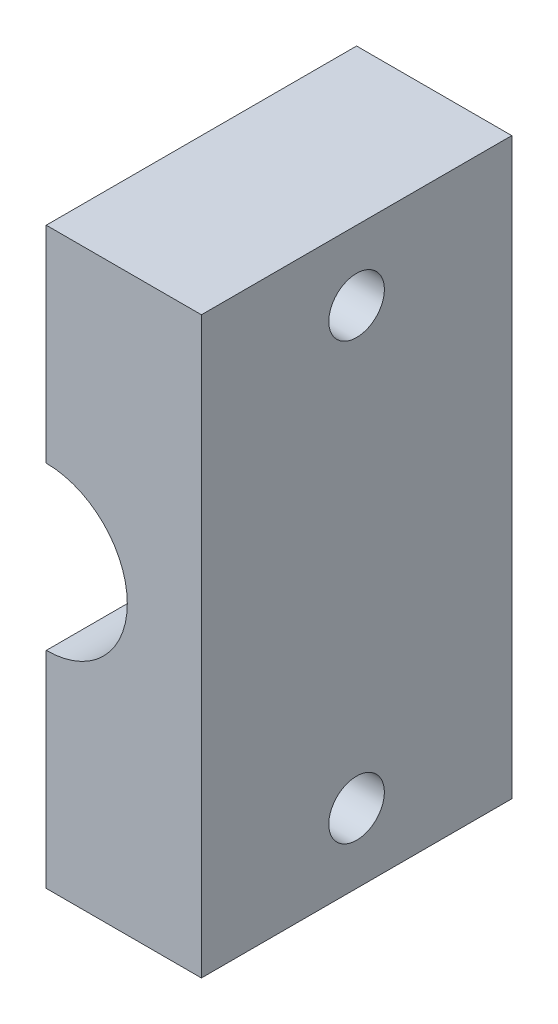
ISO-10303-21;
HEADER;
FILE_DESCRIPTION(('STEP AP214'),'2;1');
FILE_NAME('part.step','',(''),(''),'','','');
FILE_SCHEMA(('AUTOMOTIVE_DESIGN { 1 0 10303 214 1 1 1 1 }'));
ENDSEC;
DATA;
#1=APPLICATION_CONTEXT('core data for automotive mechanical design processes');
#2=APPLICATION_PROTOCOL_DEFINITION('international standard','automotive_design',2000,#1);
#3=PRODUCT_CONTEXT('',#1,'mechanical');
#4=PRODUCT('Part','Part','',(#3));
#5=PRODUCT_RELATED_PRODUCT_CATEGORY('part','',(#4));
#6=PRODUCT_DEFINITION_FORMATION('','',#4);
#7=PRODUCT_DEFINITION_CONTEXT('part definition',#1,'design');
#8=PRODUCT_DEFINITION('design','',#6,#7);
#9=PRODUCT_DEFINITION_SHAPE('','',#8);
#10=(LENGTH_UNIT() NAMED_UNIT(*) SI_UNIT(.MILLI.,.METRE.));
#11=(NAMED_UNIT(*) PLANE_ANGLE_UNIT() SI_UNIT($,.RADIAN.));
#12=(NAMED_UNIT(*) SI_UNIT($,.STERADIAN.) SOLID_ANGLE_UNIT());
#13=UNCERTAINTY_MEASURE_WITH_UNIT(LENGTH_MEASURE(1.E-05),#10,'distance_accuracy_value','');
#14=(GEOMETRIC_REPRESENTATION_CONTEXT(3) GLOBAL_UNCERTAINTY_ASSIGNED_CONTEXT((#13)) GLOBAL_UNIT_ASSIGNED_CONTEXT((#10,
#11,#12)) REPRESENTATION_CONTEXT('',''));
#15=CARTESIAN_POINT('',(0.,0.,0.));
#16=DIRECTION('',(0.,0.,1.));
#17=DIRECTION('',(1.,0.,0.));
#18=AXIS2_PLACEMENT_3D('',#15,#16,#17);
#19=CARTESIAN_POINT('',(0.,0.,2.7));
#20=DIRECTION('',(1.,0.,0.));
#21=DIRECTION('',(0.,0.,-1.));
#22=AXIS2_PLACEMENT_3D('',#19,#20,#21);
#23=PLANE('',#22);
#24=CARTESIAN_POINT('',(0.,4.7,1.35));
#25=DIRECTION('',(1.,0.,0.));
#26=DIRECTION('',(0.,0.,-1.));
#27=AXIS2_PLACEMENT_3D('',#24,#25,#26);
#28=CIRCLE('',#27,0.6);
#29=CARTESIAN_POINT('',(0.,4.7,0.75));
#30=VERTEX_POINT('',#29);
#31=EDGE_CURVE('E190',#30,#30,#28,.T.);
#32=ORIENTED_EDGE('',*,*,#31,.T.);
#33=EDGE_LOOP('',(#32));
#34=FACE_BOUND('',#33,.T.);
#35=DIRECTION('',(0.,-1.,0.));
#36=VECTOR('',#35,1.);
#37=CARTESIAN_POINT('',(0.,6.2,-2.));
#38=LINE('',#37,#36);
#39=CARTESIAN_POINT('',(0.,6.2,-2.));
#40=VERTEX_POINT('',#39);
#41=CARTESIAN_POINT('',(0.,1.75,-2.));
#42=VERTEX_POINT('',#41);
#43=EDGE_CURVE('E141',#40,#42,#38,.T.);
#44=ORIENTED_EDGE('',*,*,#43,.T.);
#45=DIRECTION('',(0.,0.,1.));
#46=VECTOR('',#45,1.);
#47=CARTESIAN_POINT('',(0.,1.75,-2.));
#48=LINE('',#47,#46);
#49=CARTESIAN_POINT('',(0.,1.75,0.));
#50=VERTEX_POINT('',#49);
#51=EDGE_CURVE('E56',#42,#50,#48,.T.);
#52=ORIENTED_EDGE('',*,*,#51,.T.);
#53=DIRECTION('',(0.,-1.,0.));
#54=VECTOR('',#53,1.);
#55=CARTESIAN_POINT('',(0.,6.2,0.));
#56=LINE('',#55,#54);
#57=CARTESIAN_POINT('',(0.,3.2,0.));
#58=VERTEX_POINT('',#57);
#59=EDGE_CURVE('E142',#58,#50,#56,.T.);
#60=ORIENTED_EDGE('',*,*,#59,.F.);
#61=DIRECTION('',(0.,0.,-1.));
#62=VECTOR('',#61,1.);
#63=CARTESIAN_POINT('',(0.,3.2,2.7));
#64=LINE('',#63,#62);
#65=CARTESIAN_POINT('',(0.,3.2,2.7));
#66=VERTEX_POINT('',#65);
#67=EDGE_CURVE('E160',#66,#58,#64,.T.);
#68=ORIENTED_EDGE('',*,*,#67,.F.);
#69=DIRECTION('',(0.,1.,0.));
#70=VECTOR('',#69,1.);
#71=CARTESIAN_POINT('',(0.,0.,2.7));
#72=LINE('',#71,#70);
#73=CARTESIAN_POINT('',(0.,1.75,2.7));
#74=VERTEX_POINT('',#73);
#75=EDGE_CURVE('E182',#74,#66,#72,.T.);
#76=ORIENTED_EDGE('',*,*,#75,.F.);
#77=CARTESIAN_POINT('',(0.,1.75,4.7));
#78=VERTEX_POINT('',#77);
#79=EDGE_CURVE('E184',#74,#78,#48,.T.);
#80=ORIENTED_EDGE('',*,*,#79,.T.);
#81=DIRECTION('',(0.,1.,0.));
#82=VECTOR('',#81,1.);
#83=CARTESIAN_POINT('',(0.,0.,4.7));
#84=LINE('',#83,#82);
#85=CARTESIAN_POINT('',(0.,6.2,4.7));
#86=VERTEX_POINT('',#85);
#87=EDGE_CURVE('E231',#78,#86,#84,.T.);
#88=ORIENTED_EDGE('',*,*,#87,.T.);
#89=DIRECTION('',(0.,0.,-1.));
#90=VECTOR('',#89,1.);
#91=CARTESIAN_POINT('',(0.,6.2,2.7));
#92=LINE('',#91,#90);
#93=EDGE_CURVE('E164',#86,#40,#92,.T.);
#94=ORIENTED_EDGE('',*,*,#93,.T.);
#95=EDGE_LOOP('',(#44,#52,#60,#68,#76,#80,#88,#94));
#96=FACE_BOUND('',#95,.T.);
#97=ADVANCED_FACE('F41',(#34,#96),#23,.F.);
#98=CARTESIAN_POINT('',(0.,0.,2.7));
#99=DIRECTION('',(0.,0.,-1.));
#100=DIRECTION('',(-1.,0.,0.));
#101=AXIS2_PLACEMENT_3D('',#98,#99,#100);
#102=CYLINDRICAL_SURFACE('',#101,3.2);
#103=CARTESIAN_POINT('',(0.,0.,0.));
#104=DIRECTION('',(0.,0.,1.));
#105=DIRECTION('',(1.,0.,0.));
#106=AXIS2_PLACEMENT_3D('',#103,#104,#105);
#107=CIRCLE('',#106,3.2);
#108=CARTESIAN_POINT('',(0.,-3.2,0.));
#109=VERTEX_POINT('',#108);
#110=EDGE_CURVE('E155',#109,#58,#107,.T.);
#111=ORIENTED_EDGE('',*,*,#110,.F.);
#112=DIRECTION('',(0.,0.,-1.));
#113=VECTOR('',#112,1.);
#114=CARTESIAN_POINT('',(0.,-3.2,2.7));
#115=LINE('',#114,#113);
#116=CARTESIAN_POINT('',(0.,-3.2,2.7));
#117=VERTEX_POINT('',#116);
#118=EDGE_CURVE('E49',#117,#109,#115,.T.);
#119=ORIENTED_EDGE('',*,*,#118,.F.);
#120=CARTESIAN_POINT('',(0.,0.,2.7));
#121=DIRECTION('',(0.,0.,1.));
#122=DIRECTION('',(1.,0.,0.));
#123=AXIS2_PLACEMENT_3D('',#120,#121,#122);
#124=CIRCLE('',#123,3.2);
#125=EDGE_CURVE('E157',#117,#66,#124,.T.);
#126=ORIENTED_EDGE('',*,*,#125,.T.);
#127=ORIENTED_EDGE('',*,*,#67,.T.);
#128=EDGE_LOOP('',(#111,#119,#126,#127));
#129=FACE_BOUND('',#128,.T.);
#130=ADVANCED_FACE('F43',(#129),#102,.F.);
#131=CARTESIAN_POINT('',(0.,-6.2,2.7));
#132=DIRECTION('',(0.,1.,0.));
#133=DIRECTION('',(0.,0.,1.));
#134=AXIS2_PLACEMENT_3D('',#131,#132,#133);
#135=PLANE('',#134);
#136=DIRECTION('',(0.,0.,-1.));
#137=VECTOR('',#136,1.);
#138=CARTESIAN_POINT('',(0.,-6.2,2.7));
#139=LINE('',#138,#137);
#140=CARTESIAN_POINT('',(0.,-6.2,4.7));
#141=VERTEX_POINT('',#140);
#142=CARTESIAN_POINT('',(0.,-6.2,-2.));
#143=VERTEX_POINT('',#142);
#144=EDGE_CURVE('E170',#141,#143,#139,.T.);
#145=ORIENTED_EDGE('',*,*,#144,.T.);
#146=DIRECTION('',(1.,0.,0.));
#147=VECTOR('',#146,1.);
#148=CARTESIAN_POINT('',(0.,-6.2,-2.));
#149=LINE('',#148,#147);
#150=CARTESIAN_POINT('',(3.35,-6.2,-2.));
#151=VERTEX_POINT('',#150);
#152=EDGE_CURVE('E140',#143,#151,#149,.T.);
#153=ORIENTED_EDGE('',*,*,#152,.T.);
#154=DIRECTION('',(0.,0.,-1.));
#155=VECTOR('',#154,1.);
#156=CARTESIAN_POINT('',(3.35,-6.2,2.7));
#157=LINE('',#156,#155);
#158=CARTESIAN_POINT('',(3.35,-6.2,4.7));
#159=VERTEX_POINT('',#158);
#160=EDGE_CURVE('E168',#159,#151,#157,.T.);
#161=ORIENTED_EDGE('',*,*,#160,.F.);
#162=DIRECTION('',(-1.,0.,0.));
#163=VECTOR('',#162,1.);
#164=CARTESIAN_POINT('',(0.,-6.2,4.7));
#165=LINE('',#164,#163);
#166=EDGE_CURVE('E226',#159,#141,#165,.T.);
#167=ORIENTED_EDGE('',*,*,#166,.T.);
#168=EDGE_LOOP('',(#145,#153,#161,#167));
#169=FACE_BOUND('',#168,.T.);
#170=ADVANCED_FACE('F214',(#169),#135,.F.);
#171=CARTESIAN_POINT('',(3.35,0.,2.7));
#172=DIRECTION('',(1.,0.,0.));
#173=DIRECTION('',(0.,0.,-1.));
#174=AXIS2_PLACEMENT_3D('',#171,#172,#173);
#175=PLANE('',#174);
#176=CARTESIAN_POINT('',(3.35,-4.7,1.35));
#177=DIRECTION('',(1.,0.,0.));
#178=DIRECTION('',(0.,0.,-1.));
#179=AXIS2_PLACEMENT_3D('',#176,#177,#178);
#180=CIRCLE('',#179,0.6);
#181=CARTESIAN_POINT('',(3.35,-4.7,0.749999999999999));
#182=VERTEX_POINT('',#181);
#183=EDGE_CURVE('E196',#182,#182,#180,.T.);
#184=ORIENTED_EDGE('',*,*,#183,.F.);
#185=EDGE_LOOP('',(#184));
#186=FACE_BOUND('',#185,.T.);
#187=CARTESIAN_POINT('',(3.35,4.7,1.35));
#188=DIRECTION('',(1.,0.,0.));
#189=DIRECTION('',(0.,0.,-1.));
#190=AXIS2_PLACEMENT_3D('',#187,#188,#189);
#191=CIRCLE('',#190,0.6);
#192=CARTESIAN_POINT('',(3.35,4.7,0.75));
#193=VERTEX_POINT('',#192);
#194=EDGE_CURVE('E193',#193,#193,#191,.T.);
#195=ORIENTED_EDGE('',*,*,#194,.F.);
#196=EDGE_LOOP('',(#195));
#197=FACE_BOUND('',#196,.T.);
#198=ORIENTED_EDGE('',*,*,#160,.T.);
#199=DIRECTION('',(0.,-1.,0.));
#200=VECTOR('',#199,1.);
#201=CARTESIAN_POINT('',(3.35,6.2,-2.));
#202=LINE('',#201,#200);
#203=CARTESIAN_POINT('',(3.35,6.2,-2.));
#204=VERTEX_POINT('',#203);
#205=EDGE_CURVE('E151',#204,#151,#202,.T.);
#206=ORIENTED_EDGE('',*,*,#205,.F.);
#207=DIRECTION('',(0.,0.,-1.));
#208=VECTOR('',#207,1.);
#209=CARTESIAN_POINT('',(3.35,6.2,2.7));
#210=LINE('',#209,#208);
#211=CARTESIAN_POINT('',(3.35,6.2,4.7));
#212=VERTEX_POINT('',#211);
#213=EDGE_CURVE('E166',#212,#204,#210,.T.);
#214=ORIENTED_EDGE('',*,*,#213,.F.);
#215=DIRECTION('',(0.,1.,0.));
#216=VECTOR('',#215,1.);
#217=CARTESIAN_POINT('',(3.35,0.,4.7));
#218=LINE('',#217,#216);
#219=EDGE_CURVE('E221',#159,#212,#218,.T.);
#220=ORIENTED_EDGE('',*,*,#219,.F.);
#221=EDGE_LOOP('',(#198,#206,#214,#220));
#222=FACE_BOUND('',#221,.T.);
#223=ADVANCED_FACE('F210',(#186,#197,#222),#175,.T.);
#224=CARTESIAN_POINT('',(0.,6.2,2.7));
#225=DIRECTION('',(0.,1.,0.));
#226=DIRECTION('',(-1.,0.,0.));
#227=AXIS2_PLACEMENT_3D('',#224,#225,#226);
#228=PLANE('',#227);
#229=ORIENTED_EDGE('',*,*,#213,.T.);
#230=DIRECTION('',(1.,0.,0.));
#231=VECTOR('',#230,1.);
#232=CARTESIAN_POINT('',(0.,6.2,-2.));
#233=LINE('',#232,#231);
#234=EDGE_CURVE('E153',#40,#204,#233,.T.);
#235=ORIENTED_EDGE('',*,*,#234,.F.);
#236=ORIENTED_EDGE('',*,*,#93,.F.);
#237=DIRECTION('',(-1.,0.,0.));
#238=VECTOR('',#237,1.);
#239=CARTESIAN_POINT('',(0.,6.2,4.7));
#240=LINE('',#239,#238);
#241=EDGE_CURVE('E234',#212,#86,#240,.T.);
#242=ORIENTED_EDGE('',*,*,#241,.F.);
#243=EDGE_LOOP('',(#229,#235,#236,#242));
#244=FACE_BOUND('',#243,.T.);
#245=ADVANCED_FACE('F213',(#244),#228,.T.);
#246=CARTESIAN_POINT('',(0.,-4.7,1.35));
#247=DIRECTION('',(1.,0.,0.));
#248=DIRECTION('',(0.,0.,-1.));
#249=AXIS2_PLACEMENT_3D('',#246,#247,#248);
#250=CIRCLE('',#249,0.6);
#251=CARTESIAN_POINT('',(0.,-4.7,0.749999999999999));
#252=VERTEX_POINT('',#251);
#253=EDGE_CURVE('E124',#252,#252,#250,.T.);
#254=ORIENTED_EDGE('',*,*,#253,.T.);
#255=EDGE_LOOP('',(#254));
#256=FACE_BOUND('',#255,.T.);
#257=CARTESIAN_POINT('',(0.,-1.75,4.7));
#258=VERTEX_POINT('',#257);
#259=EDGE_CURVE('E228',#141,#258,#84,.T.);
#260=ORIENTED_EDGE('',*,*,#259,.T.);
#261=DIRECTION('',(0.,0.,1.));
#262=VECTOR('',#261,1.);
#263=CARTESIAN_POINT('',(0.,-1.75,-2.));
#264=LINE('',#263,#262);
#265=CARTESIAN_POINT('',(0.,-1.75,2.7));
#266=VERTEX_POINT('',#265);
#267=EDGE_CURVE('E64',#258,#266,#264,.F.);
#268=ORIENTED_EDGE('',*,*,#267,.T.);
#269=EDGE_CURVE('E148',#117,#266,#72,.T.);
#270=ORIENTED_EDGE('',*,*,#269,.F.);
#271=ORIENTED_EDGE('',*,*,#118,.T.);
#272=CARTESIAN_POINT('',(0.,-1.75,0.));
#273=VERTEX_POINT('',#272);
#274=EDGE_CURVE('E133',#273,#109,#56,.T.);
#275=ORIENTED_EDGE('',*,*,#274,.F.);
#276=CARTESIAN_POINT('',(0.,-1.75,-2.));
#277=VERTEX_POINT('',#276);
#278=EDGE_CURVE('E117',#273,#277,#264,.F.);
#279=ORIENTED_EDGE('',*,*,#278,.T.);
#280=EDGE_CURVE('E130',#277,#143,#38,.T.);
#281=ORIENTED_EDGE('',*,*,#280,.T.);
#282=ORIENTED_EDGE('',*,*,#144,.F.);
#283=EDGE_LOOP('',(#260,#268,#270,#271,#275,#279,#281,#282));
#284=FACE_BOUND('',#283,.T.);
#285=ADVANCED_FACE('F129',(#256,#284),#23,.F.);
#286=CARTESIAN_POINT('',(0.,0.,0.));
#287=DIRECTION('',(0.,0.,1.));
#288=DIRECTION('',(1.,0.,0.));
#289=AXIS2_PLACEMENT_3D('',#286,#287,#288);
#290=PLANE('',#289);
#291=CARTESIAN_POINT('',(0.,0.,0.));
#292=DIRECTION('',(0.,0.,1.));
#293=DIRECTION('',(1.,0.,0.));
#294=AXIS2_PLACEMENT_3D('',#291,#292,#293);
#295=CIRCLE('',#294,1.75);
#296=EDGE_CURVE('E134',#273,#50,#295,.T.);
#297=ORIENTED_EDGE('',*,*,#296,.F.);
#298=ORIENTED_EDGE('',*,*,#274,.T.);
#299=ORIENTED_EDGE('',*,*,#110,.T.);
#300=ORIENTED_EDGE('',*,*,#59,.T.);
#301=EDGE_LOOP('',(#297,#298,#299,#300));
#302=FACE_BOUND('',#301,.T.);
#303=ADVANCED_FACE('F179',(#302),#290,.T.);
#304=CARTESIAN_POINT('',(0.,0.,-2.));
#305=DIRECTION('',(0.,0.,1.));
#306=DIRECTION('',(1.,0.,0.));
#307=AXIS2_PLACEMENT_3D('',#304,#305,#306);
#308=PLANE('',#307);
#309=ORIENTED_EDGE('',*,*,#280,.F.);
#310=CARTESIAN_POINT('',(0.,0.,-2.));
#311=DIRECTION('',(0.,0.,1.));
#312=DIRECTION('',(1.,0.,0.));
#313=AXIS2_PLACEMENT_3D('',#310,#311,#312);
#314=CIRCLE('',#313,1.75);
#315=EDGE_CURVE('E114',#277,#42,#314,.T.);
#316=ORIENTED_EDGE('',*,*,#315,.T.);
#317=ORIENTED_EDGE('',*,*,#43,.F.);
#318=ORIENTED_EDGE('',*,*,#234,.T.);
#319=ORIENTED_EDGE('',*,*,#205,.T.);
#320=ORIENTED_EDGE('',*,*,#152,.F.);
#321=EDGE_LOOP('',(#309,#316,#317,#318,#319,#320));
#322=FACE_BOUND('',#321,.T.);
#323=ADVANCED_FACE('F137',(#322),#308,.F.);
#324=CARTESIAN_POINT('',(0.,0.,2.7));
#325=DIRECTION('',(0.,0.,-1.));
#326=DIRECTION('',(-1.,0.,0.));
#327=AXIS2_PLACEMENT_3D('',#324,#325,#326);
#328=PLANE('',#327);
#329=CARTESIAN_POINT('',(0.,0.,2.7));
#330=DIRECTION('',(0.,0.,-1.));
#331=DIRECTION('',(-1.,0.,0.));
#332=AXIS2_PLACEMENT_3D('',#329,#330,#331);
#333=CIRCLE('',#332,1.75);
#334=EDGE_CURVE('E123',#74,#266,#333,.T.);
#335=ORIENTED_EDGE('',*,*,#334,.F.);
#336=ORIENTED_EDGE('',*,*,#75,.T.);
#337=ORIENTED_EDGE('',*,*,#125,.F.);
#338=ORIENTED_EDGE('',*,*,#269,.T.);
#339=EDGE_LOOP('',(#335,#336,#337,#338));
#340=FACE_BOUND('',#339,.T.);
#341=ADVANCED_FACE('F242',(#340),#328,.T.);
#342=CARTESIAN_POINT('',(0.,0.,4.7));
#343=DIRECTION('',(0.,0.,-1.));
#344=DIRECTION('',(-1.,0.,0.));
#345=AXIS2_PLACEMENT_3D('',#342,#343,#344);
#346=PLANE('',#345);
#347=ORIENTED_EDGE('',*,*,#87,.F.);
#348=CARTESIAN_POINT('',(0.,0.,4.7));
#349=DIRECTION('',(0.,0.,-1.));
#350=DIRECTION('',(-1.,0.,0.));
#351=AXIS2_PLACEMENT_3D('',#348,#349,#350);
#352=CIRCLE('',#351,1.75);
#353=EDGE_CURVE('E11',#78,#258,#352,.T.);
#354=ORIENTED_EDGE('',*,*,#353,.T.);
#355=ORIENTED_EDGE('',*,*,#259,.F.);
#356=ORIENTED_EDGE('',*,*,#166,.F.);
#357=ORIENTED_EDGE('',*,*,#219,.T.);
#358=ORIENTED_EDGE('',*,*,#241,.T.);
#359=EDGE_LOOP('',(#347,#354,#355,#356,#357,#358));
#360=FACE_BOUND('',#359,.T.);
#361=ADVANCED_FACE('F230',(#360),#346,.F.);
#362=CARTESIAN_POINT('',(0.,0.,-2.));
#363=DIRECTION('',(0.,0.,1.));
#364=DIRECTION('',(1.,0.,0.));
#365=AXIS2_PLACEMENT_3D('',#362,#363,#364);
#366=CYLINDRICAL_SURFACE('',#365,1.75);
#367=ORIENTED_EDGE('',*,*,#334,.T.);
#368=ORIENTED_EDGE('',*,*,#267,.F.);
#369=ORIENTED_EDGE('',*,*,#353,.F.);
#370=ORIENTED_EDGE('',*,*,#79,.F.);
#371=EDGE_LOOP('',(#367,#368,#369,#370));
#372=FACE_BOUND('',#371,.T.);
#373=ADVANCED_FACE('F243',(#372),#366,.F.);
#374=ORIENTED_EDGE('',*,*,#315,.F.);
#375=ORIENTED_EDGE('',*,*,#278,.F.);
#376=ORIENTED_EDGE('',*,*,#296,.T.);
#377=ORIENTED_EDGE('',*,*,#51,.F.);
#378=EDGE_LOOP('',(#374,#375,#376,#377));
#379=FACE_BOUND('',#378,.T.);
#380=ADVANCED_FACE('F116',(#379),#366,.F.);
#381=CARTESIAN_POINT('',(0.,-4.7,1.35));
#382=DIRECTION('',(1.,0.,0.));
#383=DIRECTION('',(0.,0.,-1.));
#384=AXIS2_PLACEMENT_3D('',#381,#382,#383);
#385=CYLINDRICAL_SURFACE('',#384,0.6);
#386=ORIENTED_EDGE('',*,*,#253,.F.);
#387=EDGE_LOOP('',(#386));
#388=FACE_BOUND('',#387,.T.);
#389=ORIENTED_EDGE('',*,*,#183,.T.);
#390=EDGE_LOOP('',(#389));
#391=FACE_BOUND('',#390,.T.);
#392=ADVANCED_FACE('F203',(#388,#391),#385,.F.);
#393=CARTESIAN_POINT('',(0.,4.7,1.35));
#394=DIRECTION('',(1.,0.,0.));
#395=DIRECTION('',(0.,0.,-1.));
#396=AXIS2_PLACEMENT_3D('',#393,#394,#395);
#397=CYLINDRICAL_SURFACE('',#396,0.6);
#398=ORIENTED_EDGE('',*,*,#31,.F.);
#399=EDGE_LOOP('',(#398));
#400=FACE_BOUND('',#399,.T.);
#401=ORIENTED_EDGE('',*,*,#194,.T.);
#402=EDGE_LOOP('',(#401));
#403=FACE_BOUND('',#402,.T.);
#404=ADVANCED_FACE('F206',(#400,#403),#397,.F.);
#405=CLOSED_SHELL('',(#97,#130,#170,#223,#245,#285,#303,#323,#341,#361,#373,#380,#392,#404));
#406=MANIFOLD_SOLID_BREP('B2',#405);
#407=ADVANCED_BREP_SHAPE_REPRESENTATION('',(#18,#406),#14);
#408=SHAPE_DEFINITION_REPRESENTATION(#9,#407);
ENDSEC;
END-ISO-10303-21;
